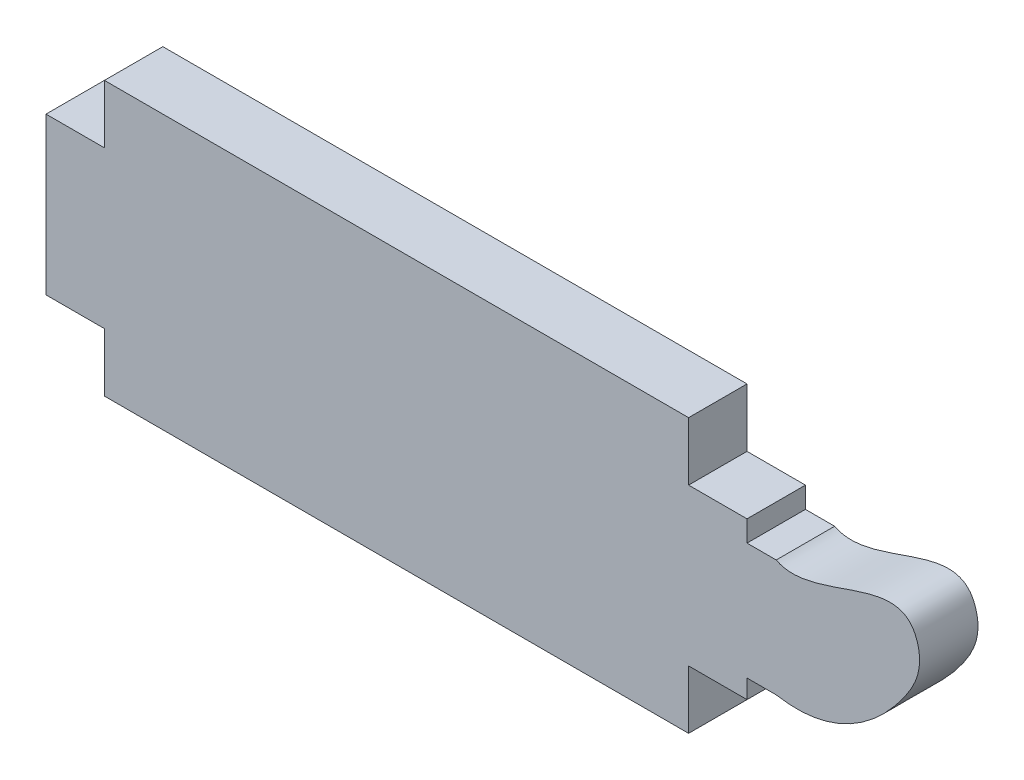
ISO-10303-21;
HEADER;
FILE_DESCRIPTION(('STEP AP214'),'2;1');
FILE_NAME('part.step','',(''),(''),'','','');
FILE_SCHEMA(('AUTOMOTIVE_DESIGN { 1 0 10303 214 1 1 1 1 }'));
ENDSEC;
DATA;
#1=APPLICATION_CONTEXT('core data for automotive mechanical design processes');
#2=APPLICATION_PROTOCOL_DEFINITION('international standard','automotive_design',2000,#1);
#3=PRODUCT_CONTEXT('',#1,'mechanical');
#4=PRODUCT('Part','Part','',(#3));
#5=PRODUCT_RELATED_PRODUCT_CATEGORY('part','',(#4));
#6=PRODUCT_DEFINITION_FORMATION('','',#4);
#7=PRODUCT_DEFINITION_CONTEXT('part definition',#1,'design');
#8=PRODUCT_DEFINITION('design','',#6,#7);
#9=PRODUCT_DEFINITION_SHAPE('','',#8);
#10=(LENGTH_UNIT() NAMED_UNIT(*) SI_UNIT(.MILLI.,.METRE.));
#11=(NAMED_UNIT(*) PLANE_ANGLE_UNIT() SI_UNIT($,.RADIAN.));
#12=(NAMED_UNIT(*) SI_UNIT($,.STERADIAN.) SOLID_ANGLE_UNIT());
#13=UNCERTAINTY_MEASURE_WITH_UNIT(LENGTH_MEASURE(1.E-05),#10,'distance_accuracy_value','');
#14=(GEOMETRIC_REPRESENTATION_CONTEXT(3) GLOBAL_UNCERTAINTY_ASSIGNED_CONTEXT((#13)) GLOBAL_UNIT_ASSIGNED_CONTEXT((#10,
#11,#12)) REPRESENTATION_CONTEXT('',''));
#15=CARTESIAN_POINT('',(0.,0.,0.));
#16=DIRECTION('',(0.,0.,1.));
#17=DIRECTION('',(1.,0.,0.));
#18=AXIS2_PLACEMENT_3D('',#15,#16,#17);
#19=CARTESIAN_POINT('',(3.17499999999999,9.83210219458268,-3.175));
#20=DIRECTION('',(0.,-1.,0.));
#21=DIRECTION('',(0.,0.,-1.));
#22=AXIS2_PLACEMENT_3D('',#19,#20,#21);
#23=PLANE('',#22);
#24=DIRECTION('',(1.,0.,0.));
#25=VECTOR('',#24,1.);
#26=CARTESIAN_POINT('',(3.17499999999999,9.83210219458268,0.));
#27=LINE('',#26,#25);
#28=CARTESIAN_POINT('',(3.17499999999999,9.83210219458268,0.));
#29=VERTEX_POINT('',#28);
#30=CARTESIAN_POINT('',(4.76249999999999,9.83210219458267,0.));
#31=VERTEX_POINT('',#30);
#32=EDGE_CURVE('E177',#29,#31,#27,.T.);
#33=ORIENTED_EDGE('',*,*,#32,.F.);
#34=DIRECTION('',(0.,0.,1.));
#35=VECTOR('',#34,1.);
#36=CARTESIAN_POINT('',(3.17499999999999,9.83210219458268,-3.175));
#37=LINE('',#36,#35);
#38=CARTESIAN_POINT('',(3.17499999999999,9.83210219458268,-3.175));
#39=VERTEX_POINT('',#38);
#40=EDGE_CURVE('E11',#39,#29,#37,.T.);
#41=ORIENTED_EDGE('',*,*,#40,.F.);
#42=DIRECTION('',(1.,0.,0.));
#43=VECTOR('',#42,1.);
#44=CARTESIAN_POINT('',(3.17499999999999,9.83210219458268,-3.175));
#45=LINE('',#44,#43);
#46=CARTESIAN_POINT('',(4.76249999999999,9.83210219458267,-3.175));
#47=VERTEX_POINT('',#46);
#48=EDGE_CURVE('E223',#39,#47,#45,.T.);
#49=ORIENTED_EDGE('',*,*,#48,.T.);
#50=DIRECTION('',(0.,0.,1.));
#51=VECTOR('',#50,1.);
#52=CARTESIAN_POINT('',(4.76249999999999,9.83210219458267,-3.175));
#53=LINE('',#52,#51);
#54=EDGE_CURVE('E36',#47,#31,#53,.T.);
#55=ORIENTED_EDGE('',*,*,#54,.T.);
#56=EDGE_LOOP('',(#33,#41,#49,#55));
#57=FACE_BOUND('',#56,.T.);
#58=ADVANCED_FACE('F33',(#57),#23,.T.);
#59=CARTESIAN_POINT('',(3.17499999999999,8.81466389144122,-3.175));
#60=DIRECTION('',(1.,0.,0.));
#61=DIRECTION('',(0.,0.,-1.));
#62=AXIS2_PLACEMENT_3D('',#59,#60,#61);
#63=PLANE('',#62);
#64=DIRECTION('',(0.,1.,0.));
#65=VECTOR('',#64,1.);
#66=CARTESIAN_POINT('',(3.17499999999999,8.81466389144122,0.));
#67=LINE('',#66,#65);
#68=CARTESIAN_POINT('',(3.17499999999999,8.81466389144122,0.));
#69=VERTEX_POINT('',#68);
#70=EDGE_CURVE('E221',#69,#29,#67,.T.);
#71=ORIENTED_EDGE('',*,*,#70,.F.);
#72=DIRECTION('',(0.,0.,1.));
#73=VECTOR('',#72,1.);
#74=CARTESIAN_POINT('',(3.17499999999999,8.81466389144122,-3.175));
#75=LINE('',#74,#73);
#76=CARTESIAN_POINT('',(3.17499999999999,8.81466389144122,-3.175));
#77=VERTEX_POINT('',#76);
#78=EDGE_CURVE('E42',#77,#69,#75,.T.);
#79=ORIENTED_EDGE('',*,*,#78,.F.);
#80=DIRECTION('',(0.,1.,0.));
#81=VECTOR('',#80,1.);
#82=CARTESIAN_POINT('',(3.17499999999999,8.81466389144122,-3.175));
#83=LINE('',#82,#81);
#84=EDGE_CURVE('E158',#77,#39,#83,.T.);
#85=ORIENTED_EDGE('',*,*,#84,.T.);
#86=ORIENTED_EDGE('',*,*,#40,.T.);
#87=EDGE_LOOP('',(#71,#79,#85,#86));
#88=FACE_BOUND('',#87,.T.);
#89=ADVANCED_FACE('F255',(#88),#63,.T.);
#90=CARTESIAN_POINT('',(3.17499999999999,8.81466389144122,-3.175));
#91=DIRECTION('',(0.,1.,0.));
#92=DIRECTION('',(0.,0.,1.));
#93=AXIS2_PLACEMENT_3D('',#90,#91,#92);
#94=PLANE('',#93);
#95=DIRECTION('',(-1.,0.,0.));
#96=VECTOR('',#95,1.);
#97=CARTESIAN_POINT('',(3.17499999999999,8.81466389144122,0.));
#98=LINE('',#97,#96);
#99=CARTESIAN_POINT('',(0.,8.81466389144122,0.));
#100=VERTEX_POINT('',#99);
#101=EDGE_CURVE('E162',#69,#100,#98,.T.);
#102=ORIENTED_EDGE('',*,*,#101,.T.);
#103=DIRECTION('',(0.,0.,1.));
#104=VECTOR('',#103,1.);
#105=CARTESIAN_POINT('',(0.,8.81466389144122,-3.175));
#106=LINE('',#105,#104);
#107=CARTESIAN_POINT('',(0.,8.81466389144122,-3.175));
#108=VERTEX_POINT('',#107);
#109=EDGE_CURVE('E160',#108,#100,#106,.T.);
#110=ORIENTED_EDGE('',*,*,#109,.F.);
#111=DIRECTION('',(-1.,0.,0.));
#112=VECTOR('',#111,1.);
#113=CARTESIAN_POINT('',(3.17499999999999,8.81466389144122,-3.175));
#114=LINE('',#113,#112);
#115=EDGE_CURVE('E153',#77,#108,#114,.T.);
#116=ORIENTED_EDGE('',*,*,#115,.F.);
#117=ORIENTED_EDGE('',*,*,#78,.T.);
#118=EDGE_LOOP('',(#102,#110,#116,#117));
#119=FACE_BOUND('',#118,.T.);
#120=ADVANCED_FACE('F161',(#119),#94,.F.);
#121=CARTESIAN_POINT('',(0.,5.63966389144122,-3.175));
#122=DIRECTION('',(1.,0.,0.));
#123=DIRECTION('',(0.,1.,0.));
#124=AXIS2_PLACEMENT_3D('',#121,#122,#123);
#125=PLANE('',#124);
#126=DIRECTION('',(0.,1.,0.));
#127=VECTOR('',#126,1.);
#128=CARTESIAN_POINT('',(0.,5.63966389144122,0.));
#129=LINE('',#128,#127);
#130=CARTESIAN_POINT('',(0.,5.63966389144122,0.));
#131=VERTEX_POINT('',#130);
#132=EDGE_CURVE('E218',#131,#100,#129,.T.);
#133=ORIENTED_EDGE('',*,*,#132,.F.);
#134=DIRECTION('',(0.,0.,1.));
#135=VECTOR('',#134,1.);
#136=CARTESIAN_POINT('',(0.,5.63966389144122,-3.175));
#137=LINE('',#136,#135);
#138=CARTESIAN_POINT('',(0.,5.63966389144122,-3.175));
#139=VERTEX_POINT('',#138);
#140=EDGE_CURVE('E166',#139,#131,#137,.T.);
#141=ORIENTED_EDGE('',*,*,#140,.F.);
#142=DIRECTION('',(0.,1.,0.));
#143=VECTOR('',#142,1.);
#144=CARTESIAN_POINT('',(0.,5.63966389144122,-3.175));
#145=LINE('',#144,#143);
#146=EDGE_CURVE('E157',#139,#108,#145,.T.);
#147=ORIENTED_EDGE('',*,*,#146,.T.);
#148=ORIENTED_EDGE('',*,*,#109,.T.);
#149=EDGE_LOOP('',(#133,#141,#147,#148));
#150=FACE_BOUND('',#149,.T.);
#151=ADVANCED_FACE('F168',(#150),#125,.T.);
#152=CARTESIAN_POINT('',(0.,5.63966389144122,-3.175));
#153=DIRECTION('',(0.,1.,0.));
#154=DIRECTION('',(0.,0.,1.));
#155=AXIS2_PLACEMENT_3D('',#152,#153,#154);
#156=PLANE('',#155);
#157=DIRECTION('',(-1.,0.,0.));
#158=VECTOR('',#157,1.);
#159=CARTESIAN_POINT('',(0.,5.63966389144122,0.));
#160=LINE('',#159,#158);
#161=CARTESIAN_POINT('',(-31.75,5.63966389144122,0.));
#162=VERTEX_POINT('',#161);
#163=EDGE_CURVE('E216',#131,#162,#160,.T.);
#164=ORIENTED_EDGE('',*,*,#163,.T.);
#165=DIRECTION('',(0.,0.,1.));
#166=VECTOR('',#165,1.);
#167=CARTESIAN_POINT('',(-31.75,5.63966389144122,-3.175));
#168=LINE('',#167,#166);
#169=CARTESIAN_POINT('',(-31.75,5.63966389144122,-3.175));
#170=VERTEX_POINT('',#169);
#171=EDGE_CURVE('E227',#170,#162,#168,.T.);
#172=ORIENTED_EDGE('',*,*,#171,.F.);
#173=DIRECTION('',(-1.,0.,0.));
#174=VECTOR('',#173,1.);
#175=CARTESIAN_POINT('',(0.,5.63966389144122,-3.175));
#176=LINE('',#175,#174);
#177=EDGE_CURVE('E170',#139,#170,#176,.T.);
#178=ORIENTED_EDGE('',*,*,#177,.F.);
#179=ORIENTED_EDGE('',*,*,#140,.T.);
#180=EDGE_LOOP('',(#164,#172,#178,#179));
#181=FACE_BOUND('',#180,.T.);
#182=ADVANCED_FACE('F268',(#181),#156,.F.);
#183=CARTESIAN_POINT('',(-31.75,5.63966389144122,-3.175));
#184=DIRECTION('',(1.,0.,0.));
#185=DIRECTION('',(0.,0.,-1.));
#186=AXIS2_PLACEMENT_3D('',#183,#184,#185);
#187=PLANE('',#186);
#188=DIRECTION('',(0.,1.,0.));
#189=VECTOR('',#188,1.);
#190=CARTESIAN_POINT('',(-31.75,5.63966389144122,0.));
#191=LINE('',#190,#189);
#192=CARTESIAN_POINT('',(-31.75,8.81466389144122,0.));
#193=VERTEX_POINT('',#192);
#194=EDGE_CURVE('E213',#162,#193,#191,.T.);
#195=ORIENTED_EDGE('',*,*,#194,.T.);
#196=DIRECTION('',(0.,0.,1.));
#197=VECTOR('',#196,1.);
#198=CARTESIAN_POINT('',(-31.75,8.81466389144122,-3.175));
#199=LINE('',#198,#197);
#200=CARTESIAN_POINT('',(-31.75,8.81466389144122,-3.175));
#201=VERTEX_POINT('',#200);
#202=EDGE_CURVE('E230',#201,#193,#199,.T.);
#203=ORIENTED_EDGE('',*,*,#202,.F.);
#204=DIRECTION('',(0.,1.,0.));
#205=VECTOR('',#204,1.);
#206=CARTESIAN_POINT('',(-31.75,5.63966389144122,-3.175));
#207=LINE('',#206,#205);
#208=EDGE_CURVE('E172',#170,#201,#207,.T.);
#209=ORIENTED_EDGE('',*,*,#208,.F.);
#210=ORIENTED_EDGE('',*,*,#171,.T.);
#211=EDGE_LOOP('',(#195,#203,#209,#210));
#212=FACE_BOUND('',#211,.T.);
#213=ADVANCED_FACE('F271',(#212),#187,.F.);
#214=CARTESIAN_POINT('',(-34.925,8.81466389144122,-3.175));
#215=DIRECTION('',(0.,-1.,0.));
#216=DIRECTION('',(0.,0.,-1.));
#217=AXIS2_PLACEMENT_3D('',#214,#215,#216);
#218=PLANE('',#217);
#219=DIRECTION('',(1.,0.,0.));
#220=VECTOR('',#219,1.);
#221=CARTESIAN_POINT('',(-34.925,8.81466389144122,0.));
#222=LINE('',#221,#220);
#223=CARTESIAN_POINT('',(-34.925,8.81466389144122,0.));
#224=VERTEX_POINT('',#223);
#225=EDGE_CURVE('E210',#224,#193,#222,.T.);
#226=ORIENTED_EDGE('',*,*,#225,.F.);
#227=DIRECTION('',(0.,0.,1.));
#228=VECTOR('',#227,1.);
#229=CARTESIAN_POINT('',(-34.925,8.81466389144122,-3.175));
#230=LINE('',#229,#228);
#231=CARTESIAN_POINT('',(-34.925,8.81466389144122,-3.175));
#232=VERTEX_POINT('',#231);
#233=EDGE_CURVE('E232',#232,#224,#230,.T.);
#234=ORIENTED_EDGE('',*,*,#233,.F.);
#235=DIRECTION('',(1.,0.,0.));
#236=VECTOR('',#235,1.);
#237=CARTESIAN_POINT('',(-34.925,8.81466389144122,-3.175));
#238=LINE('',#237,#236);
#239=EDGE_CURVE('E341',#232,#201,#238,.T.);
#240=ORIENTED_EDGE('',*,*,#239,.T.);
#241=ORIENTED_EDGE('',*,*,#202,.T.);
#242=EDGE_LOOP('',(#226,#234,#240,#241));
#243=FACE_BOUND('',#242,.T.);
#244=ADVANCED_FACE('F275',(#243),#218,.T.);
#245=CARTESIAN_POINT('',(-34.925,8.81466389144122,-3.175));
#246=DIRECTION('',(1.,0.,0.));
#247=DIRECTION('',(0.,0.,-1.));
#248=AXIS2_PLACEMENT_3D('',#245,#246,#247);
#249=PLANE('',#248);
#250=DIRECTION('',(0.,1.,0.));
#251=VECTOR('',#250,1.);
#252=CARTESIAN_POINT('',(-34.925,8.81466389144122,0.));
#253=LINE('',#252,#251);
#254=CARTESIAN_POINT('',(-34.925,17.3251021945827,0.));
#255=VERTEX_POINT('',#254);
#256=EDGE_CURVE('E208',#224,#255,#253,.T.);
#257=ORIENTED_EDGE('',*,*,#256,.T.);
#258=DIRECTION('',(0.,0.,1.));
#259=VECTOR('',#258,1.);
#260=CARTESIAN_POINT('',(-34.925,17.3251021945827,-3.175));
#261=LINE('',#260,#259);
#262=CARTESIAN_POINT('',(-34.925,17.3251021945827,-3.175));
#263=VERTEX_POINT('',#262);
#264=EDGE_CURVE('E234',#263,#255,#261,.T.);
#265=ORIENTED_EDGE('',*,*,#264,.F.);
#266=DIRECTION('',(0.,1.,0.));
#267=VECTOR('',#266,1.);
#268=CARTESIAN_POINT('',(-34.925,8.81466389144122,-3.175));
#269=LINE('',#268,#267);
#270=EDGE_CURVE('E339',#232,#263,#269,.T.);
#271=ORIENTED_EDGE('',*,*,#270,.F.);
#272=ORIENTED_EDGE('',*,*,#233,.T.);
#273=EDGE_LOOP('',(#257,#265,#271,#272));
#274=FACE_BOUND('',#273,.T.);
#275=ADVANCED_FACE('F279',(#274),#249,.F.);
#276=CARTESIAN_POINT('',(-34.925,17.3251021945827,-3.175));
#277=DIRECTION('',(0.,-1.,0.));
#278=DIRECTION('',(0.,0.,-1.));
#279=AXIS2_PLACEMENT_3D('',#276,#277,#278);
#280=PLANE('',#279);
#281=DIRECTION('',(1.,0.,0.));
#282=VECTOR('',#281,1.);
#283=CARTESIAN_POINT('',(-34.925,17.3251021945827,0.));
#284=LINE('',#283,#282);
#285=CARTESIAN_POINT('',(-31.75,17.3251021945827,0.));
#286=VERTEX_POINT('',#285);
#287=EDGE_CURVE('E206',#255,#286,#284,.T.);
#288=ORIENTED_EDGE('',*,*,#287,.T.);
#289=DIRECTION('',(0.,0.,1.));
#290=VECTOR('',#289,1.);
#291=CARTESIAN_POINT('',(-31.75,17.3251021945827,-3.175));
#292=LINE('',#291,#290);
#293=CARTESIAN_POINT('',(-31.75,17.3251021945827,-3.175));
#294=VERTEX_POINT('',#293);
#295=EDGE_CURVE('E237',#294,#286,#292,.T.);
#296=ORIENTED_EDGE('',*,*,#295,.F.);
#297=DIRECTION('',(1.,0.,0.));
#298=VECTOR('',#297,1.);
#299=CARTESIAN_POINT('',(-34.925,17.3251021945827,-3.175));
#300=LINE('',#299,#298);
#301=EDGE_CURVE('E337',#263,#294,#300,.T.);
#302=ORIENTED_EDGE('',*,*,#301,.F.);
#303=ORIENTED_EDGE('',*,*,#264,.T.);
#304=EDGE_LOOP('',(#288,#296,#302,#303));
#305=FACE_BOUND('',#304,.T.);
#306=ADVANCED_FACE('F283',(#305),#280,.F.);
#307=CARTESIAN_POINT('',(-31.75,17.3251021945827,-3.175));
#308=DIRECTION('',(1.,0.,0.));
#309=DIRECTION('',(0.,1.,0.));
#310=AXIS2_PLACEMENT_3D('',#307,#308,#309);
#311=PLANE('',#310);
#312=DIRECTION('',(0.,1.,0.));
#313=VECTOR('',#312,1.);
#314=CARTESIAN_POINT('',(-31.75,17.3251021945827,0.));
#315=LINE('',#314,#313);
#316=CARTESIAN_POINT('',(-31.75,20.5001021945827,0.));
#317=VERTEX_POINT('',#316);
#318=EDGE_CURVE('E203',#286,#317,#315,.T.);
#319=ORIENTED_EDGE('',*,*,#318,.T.);
#320=DIRECTION('',(0.,0.,1.));
#321=VECTOR('',#320,1.);
#322=CARTESIAN_POINT('',(-31.75,20.5001021945827,-3.175));
#323=LINE('',#322,#321);
#324=CARTESIAN_POINT('',(-31.75,20.5001021945827,-3.175));
#325=VERTEX_POINT('',#324);
#326=EDGE_CURVE('E240',#325,#317,#323,.T.);
#327=ORIENTED_EDGE('',*,*,#326,.F.);
#328=DIRECTION('',(0.,1.,0.));
#329=VECTOR('',#328,1.);
#330=CARTESIAN_POINT('',(-31.75,17.3251021945827,-3.175));
#331=LINE('',#330,#329);
#332=EDGE_CURVE('E335',#294,#325,#331,.T.);
#333=ORIENTED_EDGE('',*,*,#332,.F.);
#334=ORIENTED_EDGE('',*,*,#295,.T.);
#335=EDGE_LOOP('',(#319,#327,#333,#334));
#336=FACE_BOUND('',#335,.T.);
#337=ADVANCED_FACE('F287',(#336),#311,.F.);
#338=CARTESIAN_POINT('',(0.,20.5001021945827,-3.175));
#339=DIRECTION('',(0.,1.,0.));
#340=DIRECTION('',(-1.,0.,0.));
#341=AXIS2_PLACEMENT_3D('',#338,#339,#340);
#342=PLANE('',#341);
#343=DIRECTION('',(-1.,0.,0.));
#344=VECTOR('',#343,1.);
#345=CARTESIAN_POINT('',(0.,20.5001021945827,0.));
#346=LINE('',#345,#344);
#347=CARTESIAN_POINT('',(0.,20.5001021945827,0.));
#348=VERTEX_POINT('',#347);
#349=EDGE_CURVE('E200',#348,#317,#346,.T.);
#350=ORIENTED_EDGE('',*,*,#349,.F.);
#351=DIRECTION('',(0.,0.,1.));
#352=VECTOR('',#351,1.);
#353=CARTESIAN_POINT('',(0.,20.5001021945827,-3.175));
#354=LINE('',#353,#352);
#355=CARTESIAN_POINT('',(0.,20.5001021945827,-3.175));
#356=VERTEX_POINT('',#355);
#357=EDGE_CURVE('E242',#356,#348,#354,.T.);
#358=ORIENTED_EDGE('',*,*,#357,.F.);
#359=DIRECTION('',(-1.,0.,0.));
#360=VECTOR('',#359,1.);
#361=CARTESIAN_POINT('',(0.,20.5001021945827,-3.175));
#362=LINE('',#361,#360);
#363=EDGE_CURVE('E332',#356,#325,#362,.T.);
#364=ORIENTED_EDGE('',*,*,#363,.T.);
#365=ORIENTED_EDGE('',*,*,#326,.T.);
#366=EDGE_LOOP('',(#350,#358,#364,#365));
#367=FACE_BOUND('',#366,.T.);
#368=ADVANCED_FACE('F291',(#367),#342,.T.);
#369=CARTESIAN_POINT('',(0.,20.5001021945827,-3.175));
#370=DIRECTION('',(-1.,0.,0.));
#371=DIRECTION('',(0.,-1.,0.));
#372=AXIS2_PLACEMENT_3D('',#369,#370,#371);
#373=PLANE('',#372);
#374=DIRECTION('',(0.,-1.,0.));
#375=VECTOR('',#374,1.);
#376=CARTESIAN_POINT('',(0.,20.5001021945827,0.));
#377=LINE('',#376,#375);
#378=CARTESIAN_POINT('',(0.,17.3251021945827,0.));
#379=VERTEX_POINT('',#378);
#380=EDGE_CURVE('E197',#348,#379,#377,.T.);
#381=ORIENTED_EDGE('',*,*,#380,.T.);
#382=DIRECTION('',(0.,0.,1.));
#383=VECTOR('',#382,1.);
#384=CARTESIAN_POINT('',(0.,17.3251021945827,-3.175));
#385=LINE('',#384,#383);
#386=CARTESIAN_POINT('',(0.,17.3251021945827,-3.175));
#387=VERTEX_POINT('',#386);
#388=EDGE_CURVE('E244',#387,#379,#385,.T.);
#389=ORIENTED_EDGE('',*,*,#388,.F.);
#390=DIRECTION('',(0.,-1.,0.));
#391=VECTOR('',#390,1.);
#392=CARTESIAN_POINT('',(0.,20.5001021945827,-3.175));
#393=LINE('',#392,#391);
#394=EDGE_CURVE('E330',#356,#387,#393,.T.);
#395=ORIENTED_EDGE('',*,*,#394,.F.);
#396=ORIENTED_EDGE('',*,*,#357,.T.);
#397=EDGE_LOOP('',(#381,#389,#395,#396));
#398=FACE_BOUND('',#397,.T.);
#399=ADVANCED_FACE('F295',(#398),#373,.F.);
#400=CARTESIAN_POINT('',(3.17499999999999,17.3251021945827,-3.175));
#401=DIRECTION('',(0.,1.,0.));
#402=DIRECTION('',(0.,0.,1.));
#403=AXIS2_PLACEMENT_3D('',#400,#401,#402);
#404=PLANE('',#403);
#405=DIRECTION('',(-1.,0.,0.));
#406=VECTOR('',#405,1.);
#407=CARTESIAN_POINT('',(3.17499999999999,17.3251021945827,0.));
#408=LINE('',#407,#406);
#409=CARTESIAN_POINT('',(3.17499999999999,17.3251021945827,0.));
#410=VERTEX_POINT('',#409);
#411=EDGE_CURVE('E194',#410,#379,#408,.T.);
#412=ORIENTED_EDGE('',*,*,#411,.F.);
#413=DIRECTION('',(0.,0.,1.));
#414=VECTOR('',#413,1.);
#415=CARTESIAN_POINT('',(3.17499999999999,17.3251021945827,-3.175));
#416=LINE('',#415,#414);
#417=CARTESIAN_POINT('',(3.17499999999999,17.3251021945827,-3.175));
#418=VERTEX_POINT('',#417);
#419=EDGE_CURVE('E246',#418,#410,#416,.T.);
#420=ORIENTED_EDGE('',*,*,#419,.F.);
#421=DIRECTION('',(-1.,0.,0.));
#422=VECTOR('',#421,1.);
#423=CARTESIAN_POINT('',(3.17499999999999,17.3251021945827,-3.175));
#424=LINE('',#423,#422);
#425=EDGE_CURVE('E327',#418,#387,#424,.T.);
#426=ORIENTED_EDGE('',*,*,#425,.T.);
#427=ORIENTED_EDGE('',*,*,#388,.T.);
#428=EDGE_LOOP('',(#412,#420,#426,#427));
#429=FACE_BOUND('',#428,.T.);
#430=ADVANCED_FACE('F299',(#429),#404,.T.);
#431=CARTESIAN_POINT('',(3.17499999999999,16.1821021945827,-3.175));
#432=DIRECTION('',(1.,0.,0.));
#433=DIRECTION('',(0.,1.,0.));
#434=AXIS2_PLACEMENT_3D('',#431,#432,#433);
#435=PLANE('',#434);
#436=DIRECTION('',(0.,1.,0.));
#437=VECTOR('',#436,1.);
#438=CARTESIAN_POINT('',(3.17499999999999,16.1821021945827,0.));
#439=LINE('',#438,#437);
#440=CARTESIAN_POINT('',(3.17499999999999,16.1821021945827,0.));
#441=VERTEX_POINT('',#440);
#442=EDGE_CURVE('E191',#441,#410,#439,.T.);
#443=ORIENTED_EDGE('',*,*,#442,.F.);
#444=DIRECTION('',(0.,0.,1.));
#445=VECTOR('',#444,1.);
#446=CARTESIAN_POINT('',(3.17499999999999,16.1821021945827,-3.175));
#447=LINE('',#446,#445);
#448=CARTESIAN_POINT('',(3.17499999999999,16.1821021945827,-3.175));
#449=VERTEX_POINT('',#448);
#450=EDGE_CURVE('E248',#449,#441,#447,.T.);
#451=ORIENTED_EDGE('',*,*,#450,.F.);
#452=DIRECTION('',(0.,1.,0.));
#453=VECTOR('',#452,1.);
#454=CARTESIAN_POINT('',(3.17499999999999,16.1821021945827,-3.175));
#455=LINE('',#454,#453);
#456=EDGE_CURVE('E324',#449,#418,#455,.T.);
#457=ORIENTED_EDGE('',*,*,#456,.T.);
#458=ORIENTED_EDGE('',*,*,#419,.T.);
#459=EDGE_LOOP('',(#443,#451,#457,#458));
#460=FACE_BOUND('',#459,.T.);
#461=ADVANCED_FACE('F303',(#460),#435,.T.);
#462=CARTESIAN_POINT('',(3.17499999999999,16.1821021945827,-3.175));
#463=DIRECTION('',(0.,-1.,0.));
#464=DIRECTION('',(0.,0.,-1.));
#465=AXIS2_PLACEMENT_3D('',#462,#463,#464);
#466=PLANE('',#465);
#467=DIRECTION('',(1.,0.,0.));
#468=VECTOR('',#467,1.);
#469=CARTESIAN_POINT('',(3.17499999999999,16.1821021945827,0.));
#470=LINE('',#469,#468);
#471=CARTESIAN_POINT('',(4.76249999999999,16.1821021945827,0.));
#472=VERTEX_POINT('',#471);
#473=EDGE_CURVE('E185',#441,#472,#470,.T.);
#474=ORIENTED_EDGE('',*,*,#473,.T.);
#475=DIRECTION('',(0.,0.,1.));
#476=VECTOR('',#475,1.);
#477=CARTESIAN_POINT('',(4.76249999999999,16.1821021945827,-3.175));
#478=LINE('',#477,#476);
#479=CARTESIAN_POINT('',(4.76249999999999,16.1821021945827,-3.175));
#480=VERTEX_POINT('',#479);
#481=EDGE_CURVE('E249',#480,#472,#478,.T.);
#482=ORIENTED_EDGE('',*,*,#481,.F.);
#483=DIRECTION('',(1.,0.,0.));
#484=VECTOR('',#483,1.);
#485=CARTESIAN_POINT('',(3.17499999999999,16.1821021945827,-3.175));
#486=LINE('',#485,#484);
#487=EDGE_CURVE('E319',#449,#480,#486,.T.);
#488=ORIENTED_EDGE('',*,*,#487,.F.);
#489=ORIENTED_EDGE('',*,*,#450,.T.);
#490=EDGE_LOOP('',(#474,#482,#488,#489));
#491=FACE_BOUND('',#490,.T.);
#492=ADVANCED_FACE('F307',(#491),#466,.F.);
#493=CARTESIAN_POINT('',(4.76249999999999,9.83210219458267,-3.175));
#494=CARTESIAN_POINT('',(7.65977808632442,9.31714992036597,-3.175));
#495=CARTESIAN_POINT('',(10.7283012464349,11.342730230087,-3.175));
#496=CARTESIAN_POINT('',(12.8261162406551,14.945670316297,-3.175));
#497=CARTESIAN_POINT('',(11.5758165455666,19.1588707007066,-3.175));
#498=CARTESIAN_POINT('',(6.71856433022909,15.166738189021,-3.175));
#499=CARTESIAN_POINT('',(4.76249999999999,16.1821021945827,-3.175));
#500=B_SPLINE_CURVE_WITH_KNOTS('',3,(#493,#494,#495,#496,#497,#498,#499),.UNSPECIFIED.,.F.,.F.,
(4,1,1,1,4),(0.,0.407368902956439,0.542633111507963,0.615483107970928,1.),.UNSPECIFIED.);
#501=DIRECTION('',(0.,0.,1.));
#502=VECTOR('',#501,1.);
#503=SURFACE_OF_LINEAR_EXTRUSION('',#500,#502);
#504=CARTESIAN_POINT('',(4.76249999999999,9.83210219458267,0.));
#505=CARTESIAN_POINT('',(7.65977808632442,9.31714992036597,0.));
#506=CARTESIAN_POINT('',(10.7283012464349,11.342730230087,0.));
#507=CARTESIAN_POINT('',(12.8261162406551,14.945670316297,0.));
#508=CARTESIAN_POINT('',(11.5758165455666,19.1588707007066,0.));
#509=CARTESIAN_POINT('',(6.71856433022909,15.166738189021,0.));
#510=CARTESIAN_POINT('',(4.76249999999999,16.1821021945827,0.));
#511=B_SPLINE_CURVE_WITH_KNOTS('',3,(#504,#505,#506,#507,#508,#509,#510),.UNSPECIFIED.,.F.,.F.,
(4,1,1,1,4),(0.,0.407368902956439,0.542633111507963,0.615483107970928,1.),.UNSPECIFIED.);
#512=EDGE_CURVE('E180',#31,#472,#511,.T.);
#513=ORIENTED_EDGE('',*,*,#512,.F.);
#514=ORIENTED_EDGE('',*,*,#54,.F.);
#515=EDGE_CURVE('E313',#47,#480,#500,.T.);
#516=ORIENTED_EDGE('',*,*,#515,.T.);
#517=ORIENTED_EDGE('',*,*,#481,.T.);
#518=EDGE_LOOP('',(#513,#514,#516,#517));
#519=FACE_BOUND('',#518,.T.);
#520=ADVANCED_FACE('F251',(#519),#503,.T.);
#521=CARTESIAN_POINT('',(12.4447406532114,14.6000181212668,-3.175));
#522=DIRECTION('',(0.,0.,-1.));
#523=DIRECTION('',(-1.,0.,0.));
#524=AXIS2_PLACEMENT_3D('',#521,#522,#523);
#525=PLANE('',#524);
#526=ORIENTED_EDGE('',*,*,#48,.F.);
#527=ORIENTED_EDGE('',*,*,#84,.F.);
#528=ORIENTED_EDGE('',*,*,#115,.T.);
#529=ORIENTED_EDGE('',*,*,#146,.F.);
#530=ORIENTED_EDGE('',*,*,#177,.T.);
#531=ORIENTED_EDGE('',*,*,#208,.T.);
#532=ORIENTED_EDGE('',*,*,#239,.F.);
#533=ORIENTED_EDGE('',*,*,#270,.T.);
#534=ORIENTED_EDGE('',*,*,#301,.T.);
#535=ORIENTED_EDGE('',*,*,#332,.T.);
#536=ORIENTED_EDGE('',*,*,#363,.F.);
#537=ORIENTED_EDGE('',*,*,#394,.T.);
#538=ORIENTED_EDGE('',*,*,#425,.F.);
#539=ORIENTED_EDGE('',*,*,#456,.F.);
#540=ORIENTED_EDGE('',*,*,#487,.T.);
#541=ORIENTED_EDGE('',*,*,#515,.F.);
#542=EDGE_LOOP('',(#526,#527,#528,#529,#530,#531,#532,#533,#534,#535,#536,#537,#538,#539,#540,#541));
#543=FACE_BOUND('',#542,.T.);
#544=ADVANCED_FACE('F155',(#543),#525,.T.);
#545=CARTESIAN_POINT('',(12.4447406532114,14.6000181212668,0.));
#546=DIRECTION('',(0.,0.,-1.));
#547=DIRECTION('',(-1.,0.,0.));
#548=AXIS2_PLACEMENT_3D('',#545,#546,#547);
#549=PLANE('',#548);
#550=ORIENTED_EDGE('',*,*,#32,.T.);
#551=ORIENTED_EDGE('',*,*,#512,.T.);
#552=ORIENTED_EDGE('',*,*,#473,.F.);
#553=ORIENTED_EDGE('',*,*,#442,.T.);
#554=ORIENTED_EDGE('',*,*,#411,.T.);
#555=ORIENTED_EDGE('',*,*,#380,.F.);
#556=ORIENTED_EDGE('',*,*,#349,.T.);
#557=ORIENTED_EDGE('',*,*,#318,.F.);
#558=ORIENTED_EDGE('',*,*,#287,.F.);
#559=ORIENTED_EDGE('',*,*,#256,.F.);
#560=ORIENTED_EDGE('',*,*,#225,.T.);
#561=ORIENTED_EDGE('',*,*,#194,.F.);
#562=ORIENTED_EDGE('',*,*,#163,.F.);
#563=ORIENTED_EDGE('',*,*,#132,.T.);
#564=ORIENTED_EDGE('',*,*,#101,.F.);
#565=ORIENTED_EDGE('',*,*,#70,.T.);
#566=EDGE_LOOP('',(#550,#551,#552,#553,#554,#555,#556,#557,#558,#559,#560,#561,#562,#563,#564,#565));
#567=FACE_BOUND('',#566,.T.);
#568=ADVANCED_FACE('F254',(#567),#549,.F.);
#569=CLOSED_SHELL('',(#58,#89,#120,#151,#182,#213,#244,#275,#306,#337,#368,#399,#430,#461,#492,
#520,#544,#568));
#570=MANIFOLD_SOLID_BREP('B2',#569);
#571=ADVANCED_BREP_SHAPE_REPRESENTATION('',(#18,#570),#14);
#572=SHAPE_DEFINITION_REPRESENTATION(#9,#571);
ENDSEC;
END-ISO-10303-21;
